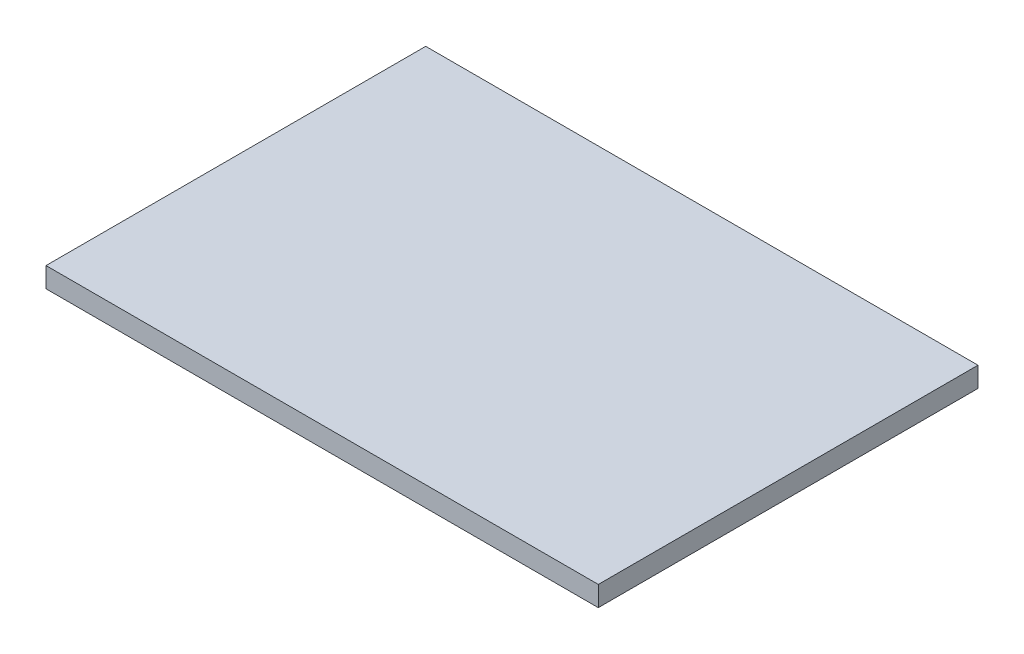
ISO-10303-21;
HEADER;
FILE_DESCRIPTION(('STEP AP214'),'2;1');
FILE_NAME('part.step','',(''),(''),'','','');
FILE_SCHEMA(('AUTOMOTIVE_DESIGN { 1 0 10303 214 1 1 1 1 }'));
ENDSEC;
DATA;
#1=APPLICATION_CONTEXT('core data for automotive mechanical design processes');
#2=APPLICATION_PROTOCOL_DEFINITION('international standard','automotive_design',2000,#1);
#3=PRODUCT_CONTEXT('',#1,'mechanical');
#4=PRODUCT('Part','Part','',(#3));
#5=PRODUCT_RELATED_PRODUCT_CATEGORY('part','',(#4));
#6=PRODUCT_DEFINITION_FORMATION('','',#4);
#7=PRODUCT_DEFINITION_CONTEXT('part definition',#1,'design');
#8=PRODUCT_DEFINITION('design','',#6,#7);
#9=PRODUCT_DEFINITION_SHAPE('','',#8);
#10=(LENGTH_UNIT() NAMED_UNIT(*) SI_UNIT(.MILLI.,.METRE.));
#11=(NAMED_UNIT(*) PLANE_ANGLE_UNIT() SI_UNIT($,.RADIAN.));
#12=(NAMED_UNIT(*) SI_UNIT($,.STERADIAN.) SOLID_ANGLE_UNIT());
#13=UNCERTAINTY_MEASURE_WITH_UNIT(LENGTH_MEASURE(1.E-05),#10,'distance_accuracy_value','');
#14=(GEOMETRIC_REPRESENTATION_CONTEXT(3) GLOBAL_UNCERTAINTY_ASSIGNED_CONTEXT((#13)) GLOBAL_UNIT_ASSIGNED_CONTEXT((#10,
#11,#12)) REPRESENTATION_CONTEXT('',''));
#15=CARTESIAN_POINT('',(0.,0.,0.));
#16=DIRECTION('',(0.,0.,1.));
#17=DIRECTION('',(1.,0.,0.));
#18=AXIS2_PLACEMENT_3D('',#15,#16,#17);
#19=CARTESIAN_POINT('',(-7214.28571428571,350.,4403.57142857143));
#20=DIRECTION('',(0.,0.,-1.));
#21=DIRECTION('',(-1.,0.,0.));
#22=AXIS2_PLACEMENT_3D('',#19,#20,#21);
#23=PLANE('',#22);
#24=DIRECTION('',(1.,0.,0.));
#25=VECTOR('',#24,1.);
#26=CARTESIAN_POINT('',(-7214.28571428571,0.,4403.57142857143));
#27=LINE('',#26,#25);
#28=CARTESIAN_POINT('',(-7214.28571428571,0.,4403.57142857143));
#29=VERTEX_POINT('',#28);
#30=CARTESIAN_POINT('',(2385.71428571429,0.,4403.57142857143));
#31=VERTEX_POINT('',#30);
#32=EDGE_CURVE('E106',#29,#31,#27,.T.);
#33=ORIENTED_EDGE('',*,*,#32,.T.);
#34=DIRECTION('',(0.,-1.,0.));
#35=VECTOR('',#34,1.);
#36=CARTESIAN_POINT('',(2385.71428571429,350.,4403.57142857143));
#37=LINE('',#36,#35);
#38=CARTESIAN_POINT('',(2385.71428571429,350.,4403.57142857143));
#39=VERTEX_POINT('',#38);
#40=EDGE_CURVE('E11',#39,#31,#37,.T.);
#41=ORIENTED_EDGE('',*,*,#40,.F.);
#42=DIRECTION('',(1.,0.,0.));
#43=VECTOR('',#42,1.);
#44=CARTESIAN_POINT('',(-7214.28571428571,350.,4403.57142857143));
#45=LINE('',#44,#43);
#46=CARTESIAN_POINT('',(-7214.28571428571,350.,4403.57142857143));
#47=VERTEX_POINT('',#46);
#48=EDGE_CURVE('E79',#47,#39,#45,.T.);
#49=ORIENTED_EDGE('',*,*,#48,.F.);
#50=DIRECTION('',(0.,-1.,0.));
#51=VECTOR('',#50,1.);
#52=CARTESIAN_POINT('',(-7214.28571428571,350.,4403.57142857143));
#53=LINE('',#52,#51);
#54=EDGE_CURVE('E102',#47,#29,#53,.T.);
#55=ORIENTED_EDGE('',*,*,#54,.T.);
#56=EDGE_LOOP('',(#33,#41,#49,#55));
#57=FACE_BOUND('',#56,.T.);
#58=ADVANCED_FACE('F39',(#57),#23,.F.);
#59=CARTESIAN_POINT('',(2385.71428571429,350.,-2196.42857142857));
#60=DIRECTION('',(1.,0.,0.));
#61=DIRECTION('',(0.,0.,-1.));
#62=AXIS2_PLACEMENT_3D('',#59,#60,#61);
#63=PLANE('',#62);
#64=DIRECTION('',(0.,0.,1.));
#65=VECTOR('',#64,1.);
#66=CARTESIAN_POINT('',(2385.71428571429,0.,-2196.42857142857));
#67=LINE('',#66,#65);
#68=CARTESIAN_POINT('',(2385.71428571429,0.,-2196.42857142857));
#69=VERTEX_POINT('',#68);
#70=EDGE_CURVE('E88',#69,#31,#67,.T.);
#71=ORIENTED_EDGE('',*,*,#70,.F.);
#72=DIRECTION('',(0.,-1.,0.));
#73=VECTOR('',#72,1.);
#74=CARTESIAN_POINT('',(2385.71428571429,350.,-2196.42857142857));
#75=LINE('',#74,#73);
#76=CARTESIAN_POINT('',(2385.71428571429,350.,-2196.42857142857));
#77=VERTEX_POINT('',#76);
#78=EDGE_CURVE('E48',#77,#69,#75,.T.);
#79=ORIENTED_EDGE('',*,*,#78,.F.);
#80=DIRECTION('',(0.,0.,1.));
#81=VECTOR('',#80,1.);
#82=CARTESIAN_POINT('',(2385.71428571429,350.,-2196.42857142857));
#83=LINE('',#82,#81);
#84=EDGE_CURVE('E86',#77,#39,#83,.T.);
#85=ORIENTED_EDGE('',*,*,#84,.T.);
#86=ORIENTED_EDGE('',*,*,#40,.T.);
#87=EDGE_LOOP('',(#71,#79,#85,#86));
#88=FACE_BOUND('',#87,.T.);
#89=ADVANCED_FACE('F85',(#88),#63,.T.);
#90=CARTESIAN_POINT('',(-7214.28571428571,350.,-2196.42857142857));
#91=DIRECTION('',(0.,0.,-1.));
#92=DIRECTION('',(-1.,0.,0.));
#93=AXIS2_PLACEMENT_3D('',#90,#91,#92);
#94=PLANE('',#93);
#95=DIRECTION('',(1.,0.,0.));
#96=VECTOR('',#95,1.);
#97=CARTESIAN_POINT('',(-7214.28571428571,0.,-2196.42857142857));
#98=LINE('',#97,#96);
#99=CARTESIAN_POINT('',(-7214.28571428571,0.,-2196.42857142857));
#100=VERTEX_POINT('',#99);
#101=EDGE_CURVE('E112',#100,#69,#98,.T.);
#102=ORIENTED_EDGE('',*,*,#101,.F.);
#103=DIRECTION('',(0.,-1.,0.));
#104=VECTOR('',#103,1.);
#105=CARTESIAN_POINT('',(-7214.28571428571,350.,-2196.42857142857));
#106=LINE('',#105,#104);
#107=CARTESIAN_POINT('',(-7214.28571428571,350.,-2196.42857142857));
#108=VERTEX_POINT('',#107);
#109=EDGE_CURVE('E71',#108,#100,#106,.T.);
#110=ORIENTED_EDGE('',*,*,#109,.F.);
#111=DIRECTION('',(1.,0.,0.));
#112=VECTOR('',#111,1.);
#113=CARTESIAN_POINT('',(-7214.28571428571,350.,-2196.42857142857));
#114=LINE('',#113,#112);
#115=EDGE_CURVE('E95',#108,#77,#114,.T.);
#116=ORIENTED_EDGE('',*,*,#115,.T.);
#117=ORIENTED_EDGE('',*,*,#78,.T.);
#118=EDGE_LOOP('',(#102,#110,#116,#117));
#119=FACE_BOUND('',#118,.T.);
#120=ADVANCED_FACE('F98',(#119),#94,.T.);
#121=CARTESIAN_POINT('',(-7214.28571428571,350.,-2196.42857142857));
#122=DIRECTION('',(1.,0.,0.));
#123=DIRECTION('',(0.,0.,-1.));
#124=AXIS2_PLACEMENT_3D('',#121,#122,#123);
#125=PLANE('',#124);
#126=DIRECTION('',(0.,0.,1.));
#127=VECTOR('',#126,1.);
#128=CARTESIAN_POINT('',(-7214.28571428571,0.,-2196.42857142857));
#129=LINE('',#128,#127);
#130=EDGE_CURVE('E74',#100,#29,#129,.T.);
#131=ORIENTED_EDGE('',*,*,#130,.T.);
#132=ORIENTED_EDGE('',*,*,#54,.F.);
#133=DIRECTION('',(0.,0.,1.));
#134=VECTOR('',#133,1.);
#135=CARTESIAN_POINT('',(-7214.28571428571,350.,-2196.42857142857));
#136=LINE('',#135,#134);
#137=EDGE_CURVE('E56',#108,#47,#136,.T.);
#138=ORIENTED_EDGE('',*,*,#137,.F.);
#139=ORIENTED_EDGE('',*,*,#109,.T.);
#140=EDGE_LOOP('',(#131,#132,#138,#139));
#141=FACE_BOUND('',#140,.T.);
#142=ADVANCED_FACE('F129',(#141),#125,.F.);
#143=CARTESIAN_POINT('',(0.,350.,0.));
#144=DIRECTION('',(0.,-1.,0.));
#145=DIRECTION('',(0.,0.,-1.));
#146=AXIS2_PLACEMENT_3D('',#143,#144,#145);
#147=PLANE('',#146);
#148=ORIENTED_EDGE('',*,*,#48,.T.);
#149=ORIENTED_EDGE('',*,*,#84,.F.);
#150=ORIENTED_EDGE('',*,*,#115,.F.);
#151=ORIENTED_EDGE('',*,*,#137,.T.);
#152=EDGE_LOOP('',(#148,#149,#150,#151));
#153=FACE_BOUND('',#152,.T.);
#154=ADVANCED_FACE('F94',(#153),#147,.F.);
#155=CARTESIAN_POINT('',(0.,0.,0.));
#156=DIRECTION('',(0.,-1.,0.));
#157=DIRECTION('',(0.,0.,-1.));
#158=AXIS2_PLACEMENT_3D('',#155,#156,#157);
#159=PLANE('',#158);
#160=ORIENTED_EDGE('',*,*,#32,.F.);
#161=ORIENTED_EDGE('',*,*,#130,.F.);
#162=ORIENTED_EDGE('',*,*,#101,.T.);
#163=ORIENTED_EDGE('',*,*,#70,.T.);
#164=EDGE_LOOP('',(#160,#161,#162,#163));
#165=FACE_BOUND('',#164,.T.);
#166=ADVANCED_FACE('F123',(#165),#159,.T.);
#167=CLOSED_SHELL('',(#58,#89,#120,#142,#154,#166));
#168=MANIFOLD_SOLID_BREP('B2',#167);
#169=ADVANCED_BREP_SHAPE_REPRESENTATION('',(#18,#168),#14);
#170=SHAPE_DEFINITION_REPRESENTATION(#9,#169);
ENDSEC;
END-ISO-10303-21;
